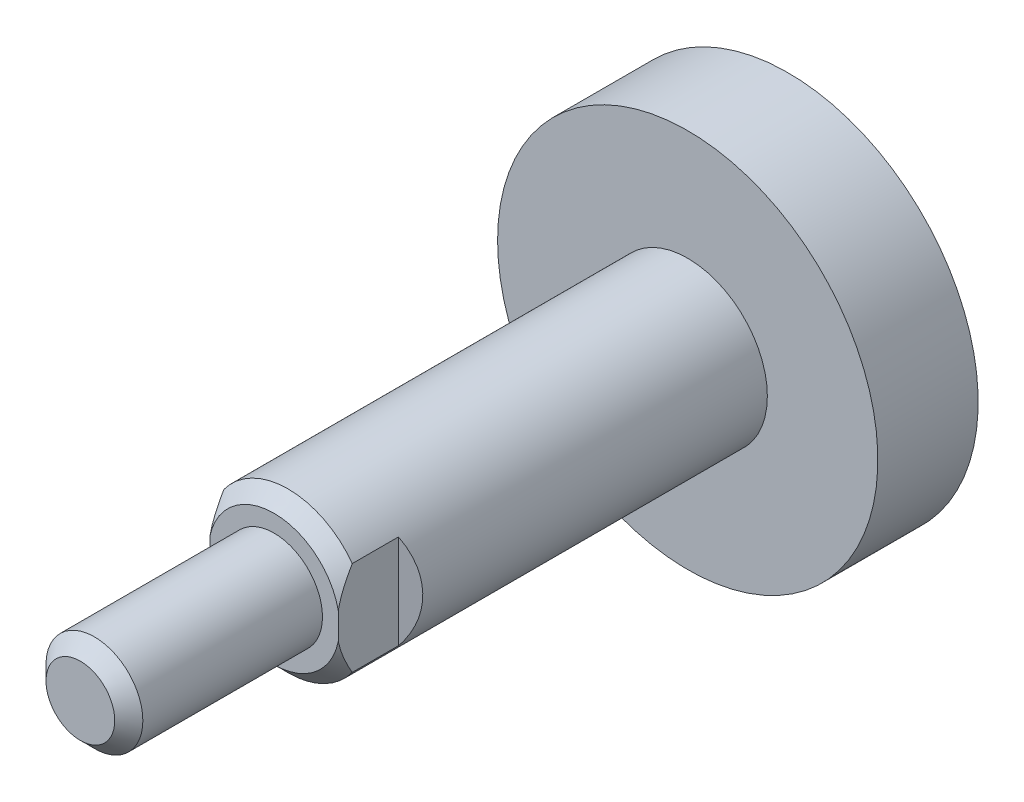
ISO-10303-21;
HEADER;
FILE_DESCRIPTION(('STEP AP214'),'2;1');
FILE_NAME('part.step','',(''),(''),'','','');
FILE_SCHEMA(('AUTOMOTIVE_DESIGN { 1 0 10303 214 1 1 1 1 }'));
ENDSEC;
DATA;
#1=APPLICATION_CONTEXT('core data for automotive mechanical design processes');
#2=APPLICATION_PROTOCOL_DEFINITION('international standard','automotive_design',2000,#1);
#3=PRODUCT_CONTEXT('',#1,'mechanical');
#4=PRODUCT('Part','Part','',(#3));
#5=PRODUCT_RELATED_PRODUCT_CATEGORY('part','',(#4));
#6=PRODUCT_DEFINITION_FORMATION('','',#4);
#7=PRODUCT_DEFINITION_CONTEXT('part definition',#1,'design');
#8=PRODUCT_DEFINITION('design','',#6,#7);
#9=PRODUCT_DEFINITION_SHAPE('','',#8);
#10=(LENGTH_UNIT() NAMED_UNIT(*) SI_UNIT(.MILLI.,.METRE.));
#11=(NAMED_UNIT(*) PLANE_ANGLE_UNIT() SI_UNIT($,.RADIAN.));
#12=(NAMED_UNIT(*) SI_UNIT($,.STERADIAN.) SOLID_ANGLE_UNIT());
#13=UNCERTAINTY_MEASURE_WITH_UNIT(LENGTH_MEASURE(1.E-05),#10,'distance_accuracy_value','');
#14=(GEOMETRIC_REPRESENTATION_CONTEXT(3) GLOBAL_UNCERTAINTY_ASSIGNED_CONTEXT((#13)) GLOBAL_UNIT_ASSIGNED_CONTEXT((#10,
#11,#12)) REPRESENTATION_CONTEXT('',''));
#15=CARTESIAN_POINT('',(0.,0.,0.));
#16=DIRECTION('',(0.,0.,1.));
#17=DIRECTION('',(1.,0.,0.));
#18=AXIS2_PLACEMENT_3D('',#15,#16,#17);
#19=CARTESIAN_POINT('',(0.,0.,5.));
#20=DIRECTION('',(0.,0.,-1.));
#21=DIRECTION('',(-1.,0.,0.));
#22=AXIS2_PLACEMENT_3D('',#19,#20,#21);
#23=CYLINDRICAL_SURFACE('',#22,9.475);
#24=CARTESIAN_POINT('',(0.,0.,5.));
#25=DIRECTION('',(0.,0.,-1.));
#26=DIRECTION('',(-1.,0.,0.));
#27=AXIS2_PLACEMENT_3D('',#24,#25,#26);
#28=CIRCLE('',#27,9.475);
#29=CARTESIAN_POINT('',(-9.475,0.,5.));
#30=VERTEX_POINT('',#29);
#31=EDGE_CURVE('E144',#30,#30,#28,.T.);
#32=ORIENTED_EDGE('',*,*,#31,.T.);
#33=EDGE_LOOP('',(#32));
#34=FACE_BOUND('',#33,.T.);
#35=CARTESIAN_POINT('',(0.,0.,0.));
#36=DIRECTION('',(0.,0.,-1.));
#37=DIRECTION('',(-1.,0.,0.));
#38=AXIS2_PLACEMENT_3D('',#35,#36,#37);
#39=CIRCLE('',#38,9.475);
#40=CARTESIAN_POINT('',(-9.475,0.,0.));
#41=VERTEX_POINT('',#40);
#42=EDGE_CURVE('E139',#41,#41,#39,.T.);
#43=ORIENTED_EDGE('',*,*,#42,.F.);
#44=EDGE_LOOP('',(#43));
#45=FACE_BOUND('',#44,.T.);
#46=ADVANCED_FACE('F39',(#34,#45),#23,.T.);
#47=CARTESIAN_POINT('',(9.475,0.,5.));
#48=DIRECTION('',(0.,0.,1.));
#49=DIRECTION('',(1.,0.,0.));
#50=AXIS2_PLACEMENT_3D('',#47,#48,#49);
#51=PLANE('',#50);
#52=CARTESIAN_POINT('',(0.,0.,5.));
#53=DIRECTION('',(0.,0.,1.));
#54=DIRECTION('',(1.,0.,0.));
#55=AXIS2_PLACEMENT_3D('',#52,#53,#54);
#56=CIRCLE('',#55,3.969);
#57=CARTESIAN_POINT('',(3.969,0.,5.));
#58=VERTEX_POINT('',#57);
#59=EDGE_CURVE('E140',#58,#58,#56,.T.);
#60=ORIENTED_EDGE('',*,*,#59,.F.);
#61=EDGE_LOOP('',(#60));
#62=FACE_BOUND('',#61,.T.);
#63=ORIENTED_EDGE('',*,*,#31,.F.);
#64=EDGE_LOOP('',(#63));
#65=FACE_BOUND('',#64,.T.);
#66=ADVANCED_FACE('F223',(#62,#65),#51,.T.);
#67=CARTESIAN_POINT('',(0.,0.,0.));
#68=DIRECTION('',(0.,0.,-1.));
#69=DIRECTION('',(-1.,0.,0.));
#70=AXIS2_PLACEMENT_3D('',#67,#68,#69);
#71=PLANE('',#70);
#72=ORIENTED_EDGE('',*,*,#42,.T.);
#73=EDGE_LOOP('',(#72));
#74=FACE_BOUND('',#73,.T.);
#75=ADVANCED_FACE('F229',(#74),#71,.T.);
#76=CARTESIAN_POINT('',(0.,0.,25.614));
#77=DIRECTION('',(0.,0.,-1.));
#78=DIRECTION('',(-1.,0.,0.));
#79=AXIS2_PLACEMENT_3D('',#76,#77,#78);
#80=CYLINDRICAL_SURFACE('',#79,3.969);
#81=DIRECTION('',(0.,0.,1.));
#82=VECTOR('',#81,1.);
#83=CARTESIAN_POINT('',(-3.2,2.34796954835449,17.2654508385936));
#84=LINE('',#83,#82);
#85=CARTESIAN_POINT('',(-3.2,2.34796954835449,22.614));
#86=VERTEX_POINT('',#85);
#87=CARTESIAN_POINT('',(-3.2,2.34796954835449,24.9139999999851));
#88=VERTEX_POINT('',#87);
#89=EDGE_CURVE('E100',#86,#88,#84,.T.);
#90=ORIENTED_EDGE('',*,*,#89,.T.);
#91=CARTESIAN_POINT('',(0.,0.,24.9139999999851));
#92=DIRECTION('',(0.,0.,1.));
#93=DIRECTION('',(1.,0.,0.));
#94=AXIS2_PLACEMENT_3D('',#91,#92,#93);
#95=CIRCLE('',#94,3.969);
#96=CARTESIAN_POINT('',(3.2,2.34796954835449,24.9139999999851));
#97=VERTEX_POINT('',#96);
#98=EDGE_CURVE('E66',#88,#97,#95,.F.);
#99=ORIENTED_EDGE('',*,*,#98,.T.);
#100=DIRECTION('',(0.,0.,1.));
#101=VECTOR('',#100,1.);
#102=CARTESIAN_POINT('',(3.2,2.34796954835449,17.2654508385936));
#103=LINE('',#102,#101);
#104=CARTESIAN_POINT('',(3.2,2.34796954835449,22.614));
#105=VERTEX_POINT('',#104);
#106=EDGE_CURVE('E136',#105,#97,#103,.T.);
#107=ORIENTED_EDGE('',*,*,#106,.F.);
#108=CARTESIAN_POINT('',(0.,0.,24.4615208614068));
#109=DIRECTION('',(-0.500000000000005,0.,-0.866025403784436));
#110=DIRECTION('',(-0.866025403784436,0.,0.500000000000005));
#111=AXIS2_PLACEMENT_3D('',#108,#109,#110);
#112=ELLIPSE('',#111,4.58300643682726,3.969);
#113=CARTESIAN_POINT('',(3.2,-2.34796954835449,22.614));
#114=VERTEX_POINT('',#113);
#115=EDGE_CURVE('E133',#114,#105,#112,.F.);
#116=ORIENTED_EDGE('',*,*,#115,.F.);
#117=DIRECTION('',(0.,0.,1.));
#118=VECTOR('',#117,1.);
#119=CARTESIAN_POINT('',(3.2,-2.34796954835449,17.2654508385936));
#120=LINE('',#119,#118);
#121=CARTESIAN_POINT('',(3.2,-2.34796954835449,24.9139999999851));
#122=VERTEX_POINT('',#121);
#123=EDGE_CURVE('E132',#114,#122,#120,.T.);
#124=ORIENTED_EDGE('',*,*,#123,.T.);
#125=CARTESIAN_POINT('',(0.,0.,24.9139999999851));
#126=DIRECTION('',(0.,0.,1.));
#127=DIRECTION('',(1.,0.,0.));
#128=AXIS2_PLACEMENT_3D('',#125,#126,#127);
#129=CIRCLE('',#128,3.969);
#130=CARTESIAN_POINT('',(-3.2,-2.34796954835449,24.9139999999851));
#131=VERTEX_POINT('',#130);
#132=EDGE_CURVE('E196',#122,#131,#129,.F.);
#133=ORIENTED_EDGE('',*,*,#132,.T.);
#134=DIRECTION('',(0.,0.,1.));
#135=VECTOR('',#134,1.);
#136=CARTESIAN_POINT('',(-3.2,-2.34796954835449,17.2654508385936));
#137=LINE('',#136,#135);
#138=CARTESIAN_POINT('',(-3.2,-2.34796954835449,22.614));
#139=VERTEX_POINT('',#138);
#140=EDGE_CURVE('E120',#139,#131,#137,.T.);
#141=ORIENTED_EDGE('',*,*,#140,.F.);
#142=CARTESIAN_POINT('',(0.,0.,24.4615208614068));
#143=DIRECTION('',(0.500000000000003,0.,-0.866025403784437));
#144=DIRECTION('',(0.866025403784437,0.,0.500000000000003));
#145=AXIS2_PLACEMENT_3D('',#142,#143,#144);
#146=ELLIPSE('',#145,4.58300643682726,3.969);
#147=EDGE_CURVE('E110',#86,#139,#146,.F.);
#148=ORIENTED_EDGE('',*,*,#147,.F.);
#149=EDGE_LOOP('',(#90,#99,#107,#116,#124,#133,#141,#148));
#150=FACE_BOUND('',#149,.T.);
#151=ORIENTED_EDGE('',*,*,#59,.T.);
#152=EDGE_LOOP('',(#151));
#153=FACE_BOUND('',#152,.T.);
#154=ADVANCED_FACE('F118',(#150,#153),#80,.T.);
#155=CARTESIAN_POINT('',(0.,0.,25.614));
#156=DIRECTION('',(0.,0.,1.));
#157=DIRECTION('',(1.,0.,0.));
#158=AXIS2_PLACEMENT_3D('',#155,#156,#157);
#159=PLANE('',#158);
#160=CARTESIAN_POINT('',(0.,0.,25.614));
#161=DIRECTION('',(0.,0.,1.));
#162=DIRECTION('',(1.,0.,0.));
#163=AXIS2_PLACEMENT_3D('',#160,#161,#162);
#164=CIRCLE('',#163,2.413);
#165=CARTESIAN_POINT('',(2.413,0.,25.614));
#166=VERTEX_POINT('',#165);
#167=EDGE_CURVE('E143',#166,#166,#164,.T.);
#168=ORIENTED_EDGE('',*,*,#167,.F.);
#169=EDGE_LOOP('',(#168));
#170=FACE_BOUND('',#169,.T.);
#171=DIRECTION('',(0.,-1.,0.));
#172=VECTOR('',#171,1.);
#173=CARTESIAN_POINT('',(3.2,2.34796954835449,25.614));
#174=LINE('',#173,#172);
#175=CARTESIAN_POINT('',(3.2,0.668102536967619,25.614));
#176=VERTEX_POINT('',#175);
#177=CARTESIAN_POINT('',(3.2,-0.668102536967616,25.614));
#178=VERTEX_POINT('',#177);
#179=EDGE_CURVE('E124',#176,#178,#174,.T.);
#180=ORIENTED_EDGE('',*,*,#179,.F.);
#181=CARTESIAN_POINT('',(0.,0.,25.614));
#182=DIRECTION('',(0.,0.,1.));
#183=DIRECTION('',(1.,0.,0.));
#184=AXIS2_PLACEMENT_3D('',#181,#182,#183);
#185=CIRCLE('',#184,3.2689999999851);
#186=CARTESIAN_POINT('',(-3.2,0.668102536967614,25.614));
#187=VERTEX_POINT('',#186);
#188=EDGE_CURVE('E161',#176,#187,#185,.T.);
#189=ORIENTED_EDGE('',*,*,#188,.T.);
#190=DIRECTION('',(0.,1.,0.));
#191=VECTOR('',#190,1.);
#192=CARTESIAN_POINT('',(-3.2,-2.34796954835449,25.614));
#193=LINE('',#192,#191);
#194=CARTESIAN_POINT('',(-3.2,-0.668102536967614,25.614));
#195=VERTEX_POINT('',#194);
#196=EDGE_CURVE('E116',#195,#187,#193,.T.);
#197=ORIENTED_EDGE('',*,*,#196,.F.);
#198=CARTESIAN_POINT('',(0.,0.,25.614));
#199=DIRECTION('',(0.,0.,1.));
#200=DIRECTION('',(1.,0.,0.));
#201=AXIS2_PLACEMENT_3D('',#198,#199,#200);
#202=CIRCLE('',#201,3.2689999999851);
#203=EDGE_CURVE('E157',#195,#178,#202,.T.);
#204=ORIENTED_EDGE('',*,*,#203,.T.);
#205=EDGE_LOOP('',(#180,#189,#197,#204));
#206=FACE_BOUND('',#205,.T.);
#207=ADVANCED_FACE('F207',(#170,#206),#159,.T.);
#208=CARTESIAN_POINT('',(10.5921492405907,0.,18.346140646055));
#209=DIRECTION('',(-0.500000000000005,0.,-0.866025403784436));
#210=DIRECTION('',(-0.866025403784436,0.,0.500000000000005));
#211=AXIS2_PLACEMENT_3D('',#208,#209,#210);
#212=PLANE('',#211);
#213=ORIENTED_EDGE('',*,*,#115,.T.);
#214=DIRECTION('',(0.,-1.,0.));
#215=VECTOR('',#214,1.);
#216=CARTESIAN_POINT('',(3.2,2.34796954835449,22.614));
#217=LINE('',#216,#215);
#218=EDGE_CURVE('E129',#105,#114,#217,.T.);
#219=ORIENTED_EDGE('',*,*,#218,.T.);
#220=EDGE_LOOP('',(#213,#219));
#221=FACE_BOUND('',#220,.T.);
#222=ADVANCED_FACE('F188',(#221),#212,.F.);
#223=CARTESIAN_POINT('',(3.2,2.34796954835449,17.2654508385936));
#224=DIRECTION('',(-1.,0.,0.));
#225=DIRECTION('',(0.,0.,1.));
#226=AXIS2_PLACEMENT_3D('',#223,#224,#225);
#227=PLANE('',#226);
#228=ORIENTED_EDGE('',*,*,#106,.T.);
#229=CARTESIAN_POINT('',(3.2,2.34796954835449,24.9139999999851));
#230=CARTESIAN_POINT('',(3.2,2.28227540635956,24.9528576848325));
#231=CARTESIAN_POINT('',(3.2,2.21612013326635,24.9909397041883));
#232=CARTESIAN_POINT('',(3.2,2.08277615455517,25.0652931600384));
#233=CARTESIAN_POINT('',(3.2,2.01558715527211,25.1015640691203));
#234=CARTESIAN_POINT('',(3.2,1.81330543747429,25.2067462963227));
#235=CARTESIAN_POINT('',(3.2,1.67658349375545,25.2725768397012));
#236=CARTESIAN_POINT('',(3.2,1.39788707529462,25.3932563066668));
#237=CARTESIAN_POINT('',(3.2,1.25590184059059,25.4480810761718));
#238=CARTESIAN_POINT('',(3.2,0.966123687729769,25.5431571718983));
#239=CARTESIAN_POINT('',(3.2,0.818297789736734,25.583306654114));
#240=CARTESIAN_POINT('',(3.2,0.66810253696762,25.614));
#241=B_SPLINE_CURVE_WITH_KNOTS('',3,(#229,#230,#231,#232,#233,#234,#235,#236,#237,#238,#239,
#240),.UNSPECIFIED.,.F.,.F.,(4,2,2,2,2,4),(0.,0.228972156496688,0.458010607534867,
0.912891486472239,1.36876002121793,1.82773469587439),.UNSPECIFIED.);
#242=EDGE_CURVE('E11',#97,#176,#241,.T.);
#243=ORIENTED_EDGE('',*,*,#242,.T.);
#244=ORIENTED_EDGE('',*,*,#179,.T.);
#245=CARTESIAN_POINT('',(3.2,-0.668102536967617,25.614));
#246=CARTESIAN_POINT('',(3.2,-0.791923989218196,25.5887118948175));
#247=CARTESIAN_POINT('',(3.2,-0.914214432097696,25.5569533814339));
#248=CARTESIAN_POINT('',(3.2,-1.15522323055296,25.4827867348171));
#249=CARTESIAN_POINT('',(3.2,-1.27394966572201,25.4404051094383));
#250=CARTESIAN_POINT('',(3.2,-1.50692397316391,25.3475394481955));
#251=CARTESIAN_POINT('',(3.2,-1.62120166822393,25.297128547754));
#252=CARTESIAN_POINT('',(3.2,-1.84665634625574,25.1897204576159));
#253=CARTESIAN_POINT('',(3.2,-1.95783200268468,25.1327205022079));
#254=CARTESIAN_POINT('',(3.2,-2.1147772256785,25.0475447828842));
#255=CARTESIAN_POINT('',(3.2,-2.1617013622884,25.0214620111527));
#256=CARTESIAN_POINT('',(3.2,-2.25515024746138,24.9683835316663));
#257=CARTESIAN_POINT('',(3.2,-2.30167405351979,24.9413861634435));
#258=CARTESIAN_POINT('',(3.2,-2.3479695483545,24.9139999999851));
#259=B_SPLINE_CURVE_WITH_KNOTS('',3,(#245,#246,#247,#248,#249,#250,#251,#252,#253,#254,#255,
#256,#257,#258),.UNSPECIFIED.,.F.,.F.,(4,2,2,2,2,2,4),(0.,0.378663318888726,0.756391005174176,
1.13085654267977,1.50547983423231,1.66653163359591,1.82789340198483),.UNSPECIFIED.);
#260=EDGE_CURVE('E52',#178,#122,#259,.T.);
#261=ORIENTED_EDGE('',*,*,#260,.T.);
#262=ORIENTED_EDGE('',*,*,#123,.F.);
#263=ORIENTED_EDGE('',*,*,#218,.F.);
#264=EDGE_LOOP('',(#228,#243,#244,#261,#262,#263));
#265=FACE_BOUND('',#264,.T.);
#266=ADVANCED_FACE('F184',(#265),#227,.F.);
#267=CARTESIAN_POINT('',(-10.5921492405907,0.,18.346140646055));
#268=DIRECTION('',(0.500000000000003,0.,-0.866025403784437));
#269=DIRECTION('',(-0.866025403784437,0.,-0.500000000000003));
#270=AXIS2_PLACEMENT_3D('',#267,#268,#269);
#271=PLANE('',#270);
#272=ORIENTED_EDGE('',*,*,#147,.T.);
#273=DIRECTION('',(0.,1.,0.));
#274=VECTOR('',#273,1.);
#275=CARTESIAN_POINT('',(-3.2,-2.34796954835449,22.614));
#276=LINE('',#275,#274);
#277=EDGE_CURVE('E105',#139,#86,#276,.T.);
#278=ORIENTED_EDGE('',*,*,#277,.T.);
#279=EDGE_LOOP('',(#272,#278));
#280=FACE_BOUND('',#279,.T.);
#281=ADVANCED_FACE('F113',(#280),#271,.F.);
#282=CARTESIAN_POINT('',(-3.2,-2.34796954835449,17.2654508385936));
#283=DIRECTION('',(1.,0.,0.));
#284=DIRECTION('',(0.,0.,-1.));
#285=AXIS2_PLACEMENT_3D('',#282,#283,#284);
#286=PLANE('',#285);
#287=ORIENTED_EDGE('',*,*,#196,.T.);
#288=CARTESIAN_POINT('',(-3.2,0.668102536967614,25.614));
#289=CARTESIAN_POINT('',(-3.2,0.791923989218192,25.5887118948175));
#290=CARTESIAN_POINT('',(-3.2,0.914214432097692,25.5569533814339));
#291=CARTESIAN_POINT('',(-3.2,1.15522323055295,25.4827867348171));
#292=CARTESIAN_POINT('',(-3.2,1.27394966572201,25.4404051094383));
#293=CARTESIAN_POINT('',(-3.2,1.5069239731639,25.3475394481955));
#294=CARTESIAN_POINT('',(-3.2,1.62120166822392,25.297128547754));
#295=CARTESIAN_POINT('',(-3.2,1.84665634625573,25.1897204576159));
#296=CARTESIAN_POINT('',(-3.2,1.95783200268468,25.1327205022079));
#297=CARTESIAN_POINT('',(-3.2,2.11477722567849,25.0475447828842));
#298=CARTESIAN_POINT('',(-3.2,2.16170136228839,25.0214620111527));
#299=CARTESIAN_POINT('',(-3.2,2.25515024746138,24.9683835316663));
#300=CARTESIAN_POINT('',(-3.2,2.30167405351979,24.9413861634435));
#301=CARTESIAN_POINT('',(-3.2,2.3479695483545,24.9139999999851));
#302=B_SPLINE_CURVE_WITH_KNOTS('',3,(#288,#289,#290,#291,#292,#293,#294,#295,#296,#297,#298,
#299,#300,#301),.UNSPECIFIED.,.F.,.F.,(4,2,2,2,2,2,4),(0.,0.378663318888725,0.756391005174174,
1.13085654267977,1.50547983423231,1.6665316335959,1.82789340198483),.UNSPECIFIED.);
#303=EDGE_CURVE('E107',#187,#88,#302,.T.);
#304=ORIENTED_EDGE('',*,*,#303,.T.);
#305=ORIENTED_EDGE('',*,*,#89,.F.);
#306=ORIENTED_EDGE('',*,*,#277,.F.);
#307=ORIENTED_EDGE('',*,*,#140,.T.);
#308=CARTESIAN_POINT('',(-3.2,-2.34796954835449,24.9139999999851));
#309=CARTESIAN_POINT('',(-3.2,-2.28227540635956,24.9528576848325));
#310=CARTESIAN_POINT('',(-3.2,-2.21612013326635,24.9909397041883));
#311=CARTESIAN_POINT('',(-3.2,-2.08277615455517,25.0652931600384));
#312=CARTESIAN_POINT('',(-3.2,-2.01558715527211,25.1015640691203));
#313=CARTESIAN_POINT('',(-3.2,-1.81330543747429,25.2067462963227));
#314=CARTESIAN_POINT('',(-3.2,-1.67658349375545,25.2725768397012));
#315=CARTESIAN_POINT('',(-3.2,-1.39788707529462,25.3932563066668));
#316=CARTESIAN_POINT('',(-3.2,-1.25590184059059,25.4480810761718));
#317=CARTESIAN_POINT('',(-3.2,-0.966123687729765,25.5431571718983));
#318=CARTESIAN_POINT('',(-3.2,-0.81829778973673,25.583306654114));
#319=CARTESIAN_POINT('',(-3.2,-0.668102536967615,25.614));
#320=B_SPLINE_CURVE_WITH_KNOTS('',3,(#308,#309,#310,#311,#312,#313,#314,#315,#316,#317,#318,
#319),.UNSPECIFIED.,.F.,.F.,(4,2,2,2,2,4),(0.,0.228972156496687,0.458010607534866,
0.91289148647224,1.36876002121794,1.82773469587439),.UNSPECIFIED.);
#321=EDGE_CURVE('E165',#131,#195,#320,.T.);
#322=ORIENTED_EDGE('',*,*,#321,.T.);
#323=EDGE_LOOP('',(#287,#304,#305,#306,#307,#322));
#324=FACE_BOUND('',#323,.T.);
#325=ADVANCED_FACE('F103',(#324),#286,.F.);
#326=CARTESIAN_POINT('',(0.,0.,35.266));
#327=DIRECTION('',(0.,0.,-1.));
#328=DIRECTION('',(-1.,0.,0.));
#329=AXIS2_PLACEMENT_3D('',#326,#327,#328);
#330=CYLINDRICAL_SURFACE('',#329,2.413);
#331=CARTESIAN_POINT('',(0.,0.,34.5659999999851));
#332=DIRECTION('',(0.,0.,1.));
#333=DIRECTION('',(1.,0.,0.));
#334=AXIS2_PLACEMENT_3D('',#331,#332,#333);
#335=CIRCLE('',#334,2.413);
#336=CARTESIAN_POINT('',(2.413,0.,34.5659999999851));
#337=VERTEX_POINT('',#336);
#338=EDGE_CURVE('E153',#337,#337,#335,.F.);
#339=ORIENTED_EDGE('',*,*,#338,.T.);
#340=EDGE_LOOP('',(#339));
#341=FACE_BOUND('',#340,.T.);
#342=ORIENTED_EDGE('',*,*,#167,.T.);
#343=EDGE_LOOP('',(#342));
#344=FACE_BOUND('',#343,.T.);
#345=ADVANCED_FACE('F180',(#341,#344),#330,.T.);
#346=CARTESIAN_POINT('',(0.,0.,35.266));
#347=DIRECTION('',(0.,0.,1.));
#348=DIRECTION('',(1.,0.,0.));
#349=AXIS2_PLACEMENT_3D('',#346,#347,#348);
#350=PLANE('',#349);
#351=CARTESIAN_POINT('',(0.,0.,35.266));
#352=DIRECTION('',(0.,0.,1.));
#353=DIRECTION('',(1.,0.,0.));
#354=AXIS2_PLACEMENT_3D('',#351,#352,#353);
#355=CIRCLE('',#354,1.71299999998509);
#356=CARTESIAN_POINT('',(1.71299999998509,0.,35.266));
#357=VERTEX_POINT('',#356);
#358=EDGE_CURVE('E149',#357,#357,#355,.T.);
#359=ORIENTED_EDGE('',*,*,#358,.T.);
#360=EDGE_LOOP('',(#359));
#361=FACE_BOUND('',#360,.T.);
#362=ADVANCED_FACE('F237',(#361),#350,.T.);
#363=CARTESIAN_POINT('',(0.,0.,35.266));
#364=DIRECTION('',(0.,0.,-1.));
#365=DIRECTION('',(-1.,0.,0.));
#366=AXIS2_PLACEMENT_3D('',#363,#364,#365);
#367=CONICAL_SURFACE('',#366,1.71299999998509,0.785398163397444);
#368=ORIENTED_EDGE('',*,*,#338,.F.);
#369=EDGE_LOOP('',(#368));
#370=FACE_BOUND('',#369,.T.);
#371=ORIENTED_EDGE('',*,*,#358,.F.);
#372=EDGE_LOOP('',(#371));
#373=FACE_BOUND('',#372,.T.);
#374=ADVANCED_FACE('F235',(#370,#373),#367,.T.);
#375=CARTESIAN_POINT('',(0.,0.,25.614));
#376=DIRECTION('',(0.,0.,-1.));
#377=DIRECTION('',(-1.,0.,0.));
#378=AXIS2_PLACEMENT_3D('',#375,#376,#377);
#379=CONICAL_SURFACE('',#378,3.2689999999851,0.785398163397438);
#380=ORIENTED_EDGE('',*,*,#242,.F.);
#381=ORIENTED_EDGE('',*,*,#98,.F.);
#382=ORIENTED_EDGE('',*,*,#303,.F.);
#383=ORIENTED_EDGE('',*,*,#188,.F.);
#384=EDGE_LOOP('',(#380,#381,#382,#383));
#385=FACE_BOUND('',#384,.T.);
#386=ADVANCED_FACE('F216',(#385),#379,.T.);
#387=CARTESIAN_POINT('',(0.,0.,25.614));
#388=DIRECTION('',(0.,0.,-1.));
#389=DIRECTION('',(-1.,0.,0.));
#390=AXIS2_PLACEMENT_3D('',#387,#388,#389);
#391=CONICAL_SURFACE('',#390,3.2689999999851,0.785398163397438);
#392=ORIENTED_EDGE('',*,*,#321,.F.);
#393=ORIENTED_EDGE('',*,*,#132,.F.);
#394=ORIENTED_EDGE('',*,*,#260,.F.);
#395=ORIENTED_EDGE('',*,*,#203,.F.);
#396=EDGE_LOOP('',(#392,#393,#394,#395));
#397=FACE_BOUND('',#396,.T.);
#398=ADVANCED_FACE('F41',(#397),#391,.T.);
#399=CLOSED_SHELL('',(#46,#66,#75,#154,#207,#222,#266,#281,#325,#345,#362,#374,#386,#398));
#400=MANIFOLD_SOLID_BREP('B2',#399);
#401=ADVANCED_BREP_SHAPE_REPRESENTATION('',(#18,#400),#14);
#402=SHAPE_DEFINITION_REPRESENTATION(#9,#401);
ENDSEC;
END-ISO-10303-21;
